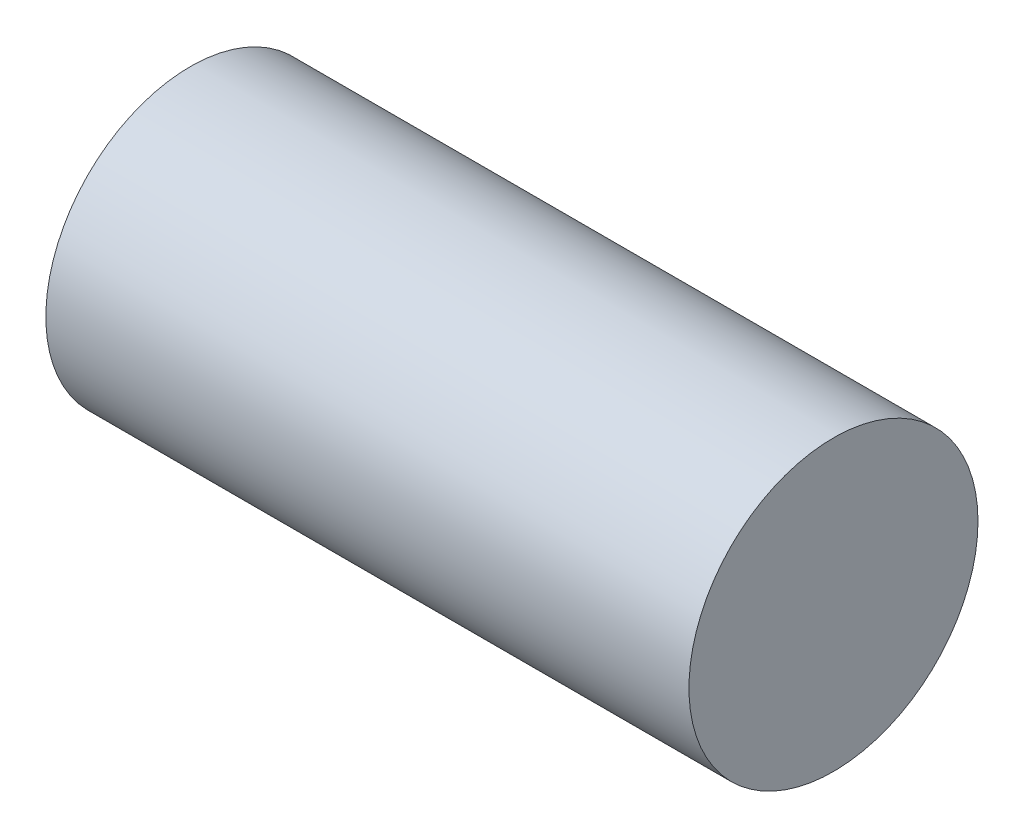
ISO-10303-21;
HEADER;
FILE_DESCRIPTION(('STEP AP214'),'2;1');
FILE_NAME('part.step','',(''),(''),'','','');
FILE_SCHEMA(('AUTOMOTIVE_DESIGN { 1 0 10303 214 1 1 1 1 }'));
ENDSEC;
DATA;
#1=APPLICATION_CONTEXT('core data for automotive mechanical design processes');
#2=APPLICATION_PROTOCOL_DEFINITION('international standard','automotive_design',2000,#1);
#3=PRODUCT_CONTEXT('',#1,'mechanical');
#4=PRODUCT('Part','Part','',(#3));
#5=PRODUCT_RELATED_PRODUCT_CATEGORY('part','',(#4));
#6=PRODUCT_DEFINITION_FORMATION('','',#4);
#7=PRODUCT_DEFINITION_CONTEXT('part definition',#1,'design');
#8=PRODUCT_DEFINITION('design','',#6,#7);
#9=PRODUCT_DEFINITION_SHAPE('','',#8);
#10=(LENGTH_UNIT() NAMED_UNIT(*) SI_UNIT(.MILLI.,.METRE.));
#11=(NAMED_UNIT(*) PLANE_ANGLE_UNIT() SI_UNIT($,.RADIAN.));
#12=(NAMED_UNIT(*) SI_UNIT($,.STERADIAN.) SOLID_ANGLE_UNIT());
#13=UNCERTAINTY_MEASURE_WITH_UNIT(LENGTH_MEASURE(1.E-05),#10,'distance_accuracy_value','');
#14=(GEOMETRIC_REPRESENTATION_CONTEXT(3) GLOBAL_UNCERTAINTY_ASSIGNED_CONTEXT((#13)) GLOBAL_UNIT_ASSIGNED_CONTEXT((#10,
#11,#12)) REPRESENTATION_CONTEXT('',''));
#15=CARTESIAN_POINT('',(0.,0.,0.));
#16=DIRECTION('',(0.,0.,1.));
#17=DIRECTION('',(1.,0.,0.));
#18=AXIS2_PLACEMENT_3D('',#15,#16,#17);
#19=CARTESIAN_POINT('',(89.,0.,0.));
#20=DIRECTION('',(-1.,0.,0.));
#21=DIRECTION('',(0.,0.,1.));
#22=AXIS2_PLACEMENT_3D('',#19,#20,#21);
#23=CYLINDRICAL_SURFACE('',#22,20.);
#24=CARTESIAN_POINT('',(89.,0.,0.));
#25=DIRECTION('',(1.,0.,0.));
#26=DIRECTION('',(0.,0.,-1.));
#27=AXIS2_PLACEMENT_3D('',#24,#25,#26);
#28=CIRCLE('',#27,20.);
#29=CARTESIAN_POINT('',(89.,0.,-20.));
#30=VERTEX_POINT('',#29);
#31=EDGE_CURVE('E10',#30,#30,#28,.T.);
#32=ORIENTED_EDGE('',*,*,#31,.F.);
#33=EDGE_LOOP('',(#32));
#34=FACE_BOUND('',#33,.T.);
#35=CARTESIAN_POINT('',(0.,0.,0.));
#36=DIRECTION('',(1.,0.,0.));
#37=DIRECTION('',(0.,0.,-1.));
#38=AXIS2_PLACEMENT_3D('',#35,#36,#37);
#39=CIRCLE('',#38,20.);
#40=CARTESIAN_POINT('',(0.,0.,-20.));
#41=VERTEX_POINT('',#40);
#42=EDGE_CURVE('E36',#41,#41,#39,.T.);
#43=ORIENTED_EDGE('',*,*,#42,.T.);
#44=EDGE_LOOP('',(#43));
#45=FACE_BOUND('',#44,.T.);
#46=ADVANCED_FACE('F33',(#34,#45),#23,.T.);
#47=CARTESIAN_POINT('',(89.,0.,0.));
#48=DIRECTION('',(1.,0.,0.));
#49=DIRECTION('',(0.,0.,-1.));
#50=AXIS2_PLACEMENT_3D('',#47,#48,#49);
#51=PLANE('',#50);
#52=ORIENTED_EDGE('',*,*,#31,.T.);
#53=EDGE_LOOP('',(#52));
#54=FACE_BOUND('',#53,.T.);
#55=ADVANCED_FACE('F48',(#54),#51,.T.);
#56=CARTESIAN_POINT('',(0.,0.,0.));
#57=DIRECTION('',(1.,0.,0.));
#58=DIRECTION('',(0.,0.,-1.));
#59=AXIS2_PLACEMENT_3D('',#56,#57,#58);
#60=PLANE('',#59);
#61=ORIENTED_EDGE('',*,*,#42,.F.);
#62=EDGE_LOOP('',(#61));
#63=FACE_BOUND('',#62,.T.);
#64=ADVANCED_FACE('F46',(#63),#60,.F.);
#65=CLOSED_SHELL('',(#46,#55,#64));
#66=MANIFOLD_SOLID_BREP('B2',#65);
#67=ADVANCED_BREP_SHAPE_REPRESENTATION('',(#18,#66),#14);
#68=SHAPE_DEFINITION_REPRESENTATION(#9,#67);
ENDSEC;
END-ISO-10303-21;
